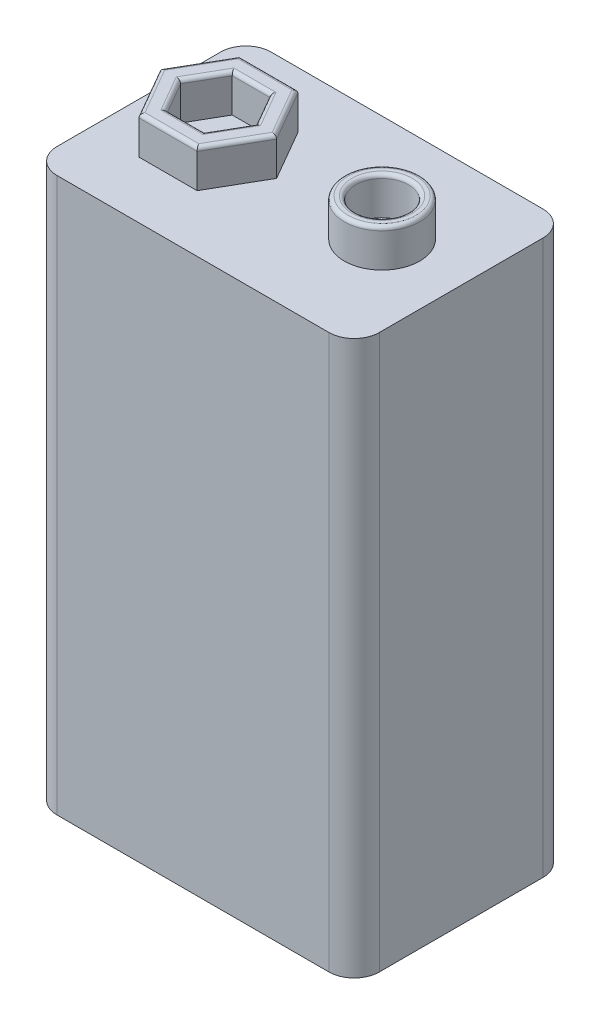
ISO-10303-21;
HEADER;
FILE_DESCRIPTION(('STEP AP214'),'2;1');
FILE_NAME('part.step','',(''),(''),'','','');
FILE_SCHEMA(('AUTOMOTIVE_DESIGN { 1 0 10303 214 1 1 1 1 }'));
ENDSEC;
DATA;
#1=APPLICATION_CONTEXT('core data for automotive mechanical design processes');
#2=APPLICATION_PROTOCOL_DEFINITION('international standard','automotive_design',2000,#1);
#3=PRODUCT_CONTEXT('',#1,'mechanical');
#4=PRODUCT('Part','Part','',(#3));
#5=PRODUCT_RELATED_PRODUCT_CATEGORY('part','',(#4));
#6=PRODUCT_DEFINITION_FORMATION('','',#4);
#7=PRODUCT_DEFINITION_CONTEXT('part definition',#1,'design');
#8=PRODUCT_DEFINITION('design','',#6,#7);
#9=PRODUCT_DEFINITION_SHAPE('','',#8);
#10=(LENGTH_UNIT() NAMED_UNIT(*) SI_UNIT(.MILLI.,.METRE.));
#11=(NAMED_UNIT(*) PLANE_ANGLE_UNIT() SI_UNIT($,.RADIAN.));
#12=(NAMED_UNIT(*) SI_UNIT($,.STERADIAN.) SOLID_ANGLE_UNIT());
#13=UNCERTAINTY_MEASURE_WITH_UNIT(LENGTH_MEASURE(1.E-05),#10,'distance_accuracy_value','');
#14=(GEOMETRIC_REPRESENTATION_CONTEXT(3) GLOBAL_UNCERTAINTY_ASSIGNED_CONTEXT((#13)) GLOBAL_UNIT_ASSIGNED_CONTEXT((#10,
#11,#12)) REPRESENTATION_CONTEXT('',''));
#15=CARTESIAN_POINT('',(0.,0.,0.));
#16=DIRECTION('',(0.,0.,1.));
#17=DIRECTION('',(1.,0.,0.));
#18=AXIS2_PLACEMENT_3D('',#15,#16,#17);
#19=CARTESIAN_POINT('',(0.,44.,0.));
#20=DIRECTION('',(0.,-1.,0.));
#21=DIRECTION('',(0.,0.,-1.));
#22=AXIS2_PLACEMENT_3D('',#19,#20,#21);
#23=PLANE('',#22);
#24=CARTESIAN_POINT('',(6.4976700158354,44.,-0.020872178799304));
#25=DIRECTION('',(0.,-1.,0.));
#26=DIRECTION('',(0.,0.,-1.));
#27=AXIS2_PLACEMENT_3D('',#24,#25,#26);
#28=CIRCLE('',#27,3.);
#29=CARTESIAN_POINT('',(6.4976700158354,44.,-3.02087217879931));
#30=VERTEX_POINT('',#29);
#31=EDGE_CURVE('E405',#30,#30,#28,.F.);
#32=ORIENTED_EDGE('',*,*,#31,.F.);
#33=EDGE_LOOP('',(#32));
#34=FACE_BOUND('',#33,.T.);
#35=DIRECTION('',(0.,0.,-1.));
#36=VECTOR('',#35,1.);
#37=CARTESIAN_POINT('',(12.8,44.,8.5));
#38=LINE('',#37,#36);
#39=CARTESIAN_POINT('',(12.8,44.,6.5));
#40=VERTEX_POINT('',#39);
#41=CARTESIAN_POINT('',(12.8,44.,-6.5));
#42=VERTEX_POINT('',#41);
#43=EDGE_CURVE('E322',#40,#42,#38,.T.);
#44=ORIENTED_EDGE('',*,*,#43,.T.);
#45=CARTESIAN_POINT('',(10.8,44.,-6.5));
#46=DIRECTION('',(0.,-1.,0.));
#47=DIRECTION('',(0.,0.,-1.));
#48=AXIS2_PLACEMENT_3D('',#45,#46,#47);
#49=CIRCLE('',#48,2.);
#50=CARTESIAN_POINT('',(10.8,44.,-8.5));
#51=VERTEX_POINT('',#50);
#52=EDGE_CURVE('E388',#42,#51,#49,.F.);
#53=ORIENTED_EDGE('',*,*,#52,.T.);
#54=DIRECTION('',(-1.,0.,0.));
#55=VECTOR('',#54,1.);
#56=CARTESIAN_POINT('',(-12.8,44.,-8.5));
#57=LINE('',#56,#55);
#58=CARTESIAN_POINT('',(-10.8,44.,-8.5));
#59=VERTEX_POINT('',#58);
#60=EDGE_CURVE('E326',#51,#59,#57,.T.);
#61=ORIENTED_EDGE('',*,*,#60,.T.);
#62=CARTESIAN_POINT('',(-10.8,44.,-6.5));
#63=DIRECTION('',(0.,-1.,0.));
#64=DIRECTION('',(0.,0.,-1.));
#65=AXIS2_PLACEMENT_3D('',#62,#63,#64);
#66=CIRCLE('',#65,2.);
#67=CARTESIAN_POINT('',(-12.8,44.,-6.5));
#68=VERTEX_POINT('',#67);
#69=EDGE_CURVE('E382',#59,#68,#66,.F.);
#70=ORIENTED_EDGE('',*,*,#69,.T.);
#71=DIRECTION('',(0.,0.,1.));
#72=VECTOR('',#71,1.);
#73=CARTESIAN_POINT('',(-12.8,44.,8.5));
#74=LINE('',#73,#72);
#75=CARTESIAN_POINT('',(-12.8,44.,6.5));
#76=VERTEX_POINT('',#75);
#77=EDGE_CURVE('E331',#68,#76,#74,.T.);
#78=ORIENTED_EDGE('',*,*,#77,.T.);
#79=CARTESIAN_POINT('',(-10.8,44.,6.5));
#80=DIRECTION('',(0.,-1.,0.));
#81=DIRECTION('',(0.,0.,-1.));
#82=AXIS2_PLACEMENT_3D('',#79,#80,#81);
#83=CIRCLE('',#82,2.);
#84=CARTESIAN_POINT('',(-10.8,44.,8.5));
#85=VERTEX_POINT('',#84);
#86=EDGE_CURVE('E379',#76,#85,#83,.F.);
#87=ORIENTED_EDGE('',*,*,#86,.T.);
#88=DIRECTION('',(1.,0.,0.));
#89=VECTOR('',#88,1.);
#90=CARTESIAN_POINT('',(-12.8,44.,8.5));
#91=LINE('',#90,#89);
#92=CARTESIAN_POINT('',(10.8,44.,8.5));
#93=VERTEX_POINT('',#92);
#94=EDGE_CURVE('E335',#85,#93,#91,.T.);
#95=ORIENTED_EDGE('',*,*,#94,.T.);
#96=CARTESIAN_POINT('',(10.8,44.,6.5));
#97=DIRECTION('',(0.,-1.,0.));
#98=DIRECTION('',(0.,0.,-1.));
#99=AXIS2_PLACEMENT_3D('',#96,#97,#98);
#100=CIRCLE('',#99,2.);
#101=EDGE_CURVE('E385',#93,#40,#100,.F.);
#102=ORIENTED_EDGE('',*,*,#101,.T.);
#103=EDGE_LOOP('',(#44,#53,#61,#70,#78,#87,#95,#102));
#104=FACE_BOUND('',#103,.T.);
#105=DIRECTION('',(0.5,0.,-0.866025403784439));
#106=VECTOR('',#105,1.);
#107=CARTESIAN_POINT('',(-4.19292890740609,44.,3.97912782120069));
#108=LINE('',#107,#106);
#109=CARTESIAN_POINT('',(-4.19292890740609,44.,3.97912782120069));
#110=VERTEX_POINT('',#109);
#111=CARTESIAN_POINT('',(-1.88352783064759,44.,-0.0208721787993011));
#112=VERTEX_POINT('',#111);
#113=EDGE_CURVE('E226',#110,#112,#108,.T.);
#114=ORIENTED_EDGE('',*,*,#113,.F.);
#115=DIRECTION('',(1.,0.,0.));
#116=VECTOR('',#115,1.);
#117=CARTESIAN_POINT('',(-8.8117310609231,44.,3.97912782120069));
#118=LINE('',#117,#116);
#119=CARTESIAN_POINT('',(-8.8117310609231,44.,3.97912782120069));
#120=VERTEX_POINT('',#119);
#121=EDGE_CURVE('E295',#120,#110,#118,.T.);
#122=ORIENTED_EDGE('',*,*,#121,.F.);
#123=DIRECTION('',(0.5,0.,0.866025403784439));
#124=VECTOR('',#123,1.);
#125=CARTESIAN_POINT('',(-11.1211321376816,44.,-0.0208721787993057));
#126=LINE('',#125,#124);
#127=CARTESIAN_POINT('',(-11.1211321376816,44.,-0.020872178799306));
#128=VERTEX_POINT('',#127);
#129=EDGE_CURVE('E291',#128,#120,#126,.T.);
#130=ORIENTED_EDGE('',*,*,#129,.F.);
#131=DIRECTION('',(-0.5,0.,0.866025403784438));
#132=VECTOR('',#131,1.);
#133=CARTESIAN_POINT('',(-8.8117310609231,44.,-4.0208721787993));
#134=LINE('',#133,#132);
#135=CARTESIAN_POINT('',(-8.8117310609231,44.,-4.0208721787993));
#136=VERTEX_POINT('',#135);
#137=EDGE_CURVE('E287',#136,#128,#134,.T.);
#138=ORIENTED_EDGE('',*,*,#137,.F.);
#139=DIRECTION('',(-1.,0.,0.));
#140=VECTOR('',#139,1.);
#141=CARTESIAN_POINT('',(-4.1929289074061,44.,-4.02087217879931));
#142=LINE('',#141,#140);
#143=CARTESIAN_POINT('',(-4.1929289074061,44.,-4.02087217879931));
#144=VERTEX_POINT('',#143);
#145=EDGE_CURVE('E283',#144,#136,#142,.T.);
#146=ORIENTED_EDGE('',*,*,#145,.F.);
#147=DIRECTION('',(-0.5,0.,-0.866025403784439));
#148=VECTOR('',#147,1.);
#149=CARTESIAN_POINT('',(-1.88352783064759,44.,-0.0208721787993012));
#150=LINE('',#149,#148);
#151=EDGE_CURVE('E279',#112,#144,#150,.T.);
#152=ORIENTED_EDGE('',*,*,#151,.F.);
#153=EDGE_LOOP('',(#114,#122,#130,#138,#146,#152));
#154=FACE_BOUND('',#153,.T.);
#155=ADVANCED_FACE('F39',(#34,#104,#154),#23,.F.);
#156=CARTESIAN_POINT('',(12.8,44.,8.5));
#157=DIRECTION('',(-1.,0.,0.));
#158=DIRECTION('',(0.,0.,1.));
#159=AXIS2_PLACEMENT_3D('',#156,#157,#158);
#160=PLANE('',#159);
#161=DIRECTION('',(0.,0.,-1.));
#162=VECTOR('',#161,1.);
#163=CARTESIAN_POINT('',(12.8,0.,8.5));
#164=LINE('',#163,#162);
#165=CARTESIAN_POINT('',(12.8,0.,6.5));
#166=VERTEX_POINT('',#165);
#167=CARTESIAN_POINT('',(12.8,0.,-6.5));
#168=VERTEX_POINT('',#167);
#169=EDGE_CURVE('E321',#166,#168,#164,.T.);
#170=ORIENTED_EDGE('',*,*,#169,.T.);
#171=DIRECTION('',(0.,-1.,0.));
#172=VECTOR('',#171,1.);
#173=CARTESIAN_POINT('',(12.8,44.,-6.5));
#174=LINE('',#173,#172);
#175=EDGE_CURVE('E376',#168,#42,#174,.F.);
#176=ORIENTED_EDGE('',*,*,#175,.T.);
#177=ORIENTED_EDGE('',*,*,#43,.F.);
#178=DIRECTION('',(0.,-1.,0.));
#179=VECTOR('',#178,1.);
#180=CARTESIAN_POINT('',(12.8,44.,6.5));
#181=LINE('',#180,#179);
#182=EDGE_CURVE('E372',#40,#166,#181,.T.);
#183=ORIENTED_EDGE('',*,*,#182,.T.);
#184=EDGE_LOOP('',(#170,#176,#177,#183));
#185=FACE_BOUND('',#184,.T.);
#186=ADVANCED_FACE('F587',(#185),#160,.F.);
#187=CARTESIAN_POINT('',(-12.8,44.,-8.5));
#188=DIRECTION('',(0.,0.,1.));
#189=DIRECTION('',(1.,0.,0.));
#190=AXIS2_PLACEMENT_3D('',#187,#188,#189);
#191=PLANE('',#190);
#192=ORIENTED_EDGE('',*,*,#60,.F.);
#193=DIRECTION('',(0.,-1.,0.));
#194=VECTOR('',#193,1.);
#195=CARTESIAN_POINT('',(10.8,44.,-8.5));
#196=LINE('',#195,#194);
#197=CARTESIAN_POINT('',(10.8,0.,-8.5));
#198=VERTEX_POINT('',#197);
#199=EDGE_CURVE('E356',#51,#198,#196,.T.);
#200=ORIENTED_EDGE('',*,*,#199,.T.);
#201=DIRECTION('',(-1.,0.,0.));
#202=VECTOR('',#201,1.);
#203=CARTESIAN_POINT('',(-12.8,0.,-8.5));
#204=LINE('',#203,#202);
#205=CARTESIAN_POINT('',(-10.8,0.,-8.5));
#206=VERTEX_POINT('',#205);
#207=EDGE_CURVE('E343',#198,#206,#204,.T.);
#208=ORIENTED_EDGE('',*,*,#207,.T.);
#209=DIRECTION('',(0.,-1.,0.));
#210=VECTOR('',#209,1.);
#211=CARTESIAN_POINT('',(-10.8,44.,-8.5));
#212=LINE('',#211,#210);
#213=EDGE_CURVE('E339',#206,#59,#212,.F.);
#214=ORIENTED_EDGE('',*,*,#213,.T.);
#215=EDGE_LOOP('',(#192,#200,#208,#214));
#216=FACE_BOUND('',#215,.T.);
#217=ADVANCED_FACE('F594',(#216),#191,.F.);
#218=CARTESIAN_POINT('',(-12.8,44.,8.5));
#219=DIRECTION('',(1.,0.,0.));
#220=DIRECTION('',(0.,0.,-1.));
#221=AXIS2_PLACEMENT_3D('',#218,#219,#220);
#222=PLANE('',#221);
#223=ORIENTED_EDGE('',*,*,#77,.F.);
#224=DIRECTION('',(0.,-1.,0.));
#225=VECTOR('',#224,1.);
#226=CARTESIAN_POINT('',(-12.8,44.,-6.5));
#227=LINE('',#226,#225);
#228=CARTESIAN_POINT('',(-12.8,0.,-6.5));
#229=VERTEX_POINT('',#228);
#230=EDGE_CURVE('E401',#68,#229,#227,.T.);
#231=ORIENTED_EDGE('',*,*,#230,.T.);
#232=DIRECTION('',(0.,0.,1.));
#233=VECTOR('',#232,1.);
#234=CARTESIAN_POINT('',(-12.8,0.,8.5));
#235=LINE('',#234,#233);
#236=CARTESIAN_POINT('',(-12.8,0.,6.5));
#237=VERTEX_POINT('',#236);
#238=EDGE_CURVE('E347',#229,#237,#235,.T.);
#239=ORIENTED_EDGE('',*,*,#238,.T.);
#240=DIRECTION('',(0.,-1.,0.));
#241=VECTOR('',#240,1.);
#242=CARTESIAN_POINT('',(-12.8,44.,6.5));
#243=LINE('',#242,#241);
#244=EDGE_CURVE('E398',#237,#76,#243,.F.);
#245=ORIENTED_EDGE('',*,*,#244,.T.);
#246=EDGE_LOOP('',(#223,#231,#239,#245));
#247=FACE_BOUND('',#246,.T.);
#248=ADVANCED_FACE('F826',(#247),#222,.F.);
#249=CARTESIAN_POINT('',(-12.8,44.,8.5));
#250=DIRECTION('',(0.,0.,-1.));
#251=DIRECTION('',(-1.,0.,0.));
#252=AXIS2_PLACEMENT_3D('',#249,#250,#251);
#253=PLANE('',#252);
#254=DIRECTION('',(1.,0.,0.));
#255=VECTOR('',#254,1.);
#256=CARTESIAN_POINT('',(-12.8,0.,8.5));
#257=LINE('',#256,#255);
#258=CARTESIAN_POINT('',(-10.8,0.,8.5));
#259=VERTEX_POINT('',#258);
#260=CARTESIAN_POINT('',(10.8,0.,8.5));
#261=VERTEX_POINT('',#260);
#262=EDGE_CURVE('E327',#259,#261,#257,.T.);
#263=ORIENTED_EDGE('',*,*,#262,.T.);
#264=DIRECTION('',(0.,-1.,0.));
#265=VECTOR('',#264,1.);
#266=CARTESIAN_POINT('',(10.8,44.,8.5));
#267=LINE('',#266,#265);
#268=EDGE_CURVE('E395',#261,#93,#267,.F.);
#269=ORIENTED_EDGE('',*,*,#268,.T.);
#270=ORIENTED_EDGE('',*,*,#94,.F.);
#271=DIRECTION('',(0.,-1.,0.));
#272=VECTOR('',#271,1.);
#273=CARTESIAN_POINT('',(-10.8,44.,8.5));
#274=LINE('',#273,#272);
#275=EDGE_CURVE('E391',#85,#259,#274,.T.);
#276=ORIENTED_EDGE('',*,*,#275,.T.);
#277=EDGE_LOOP('',(#263,#269,#270,#276));
#278=FACE_BOUND('',#277,.T.);
#279=ADVANCED_FACE('F830',(#278),#253,.F.);
#280=CARTESIAN_POINT('',(0.,0.,0.));
#281=DIRECTION('',(0.,-1.,0.));
#282=DIRECTION('',(0.,0.,-1.));
#283=AXIS2_PLACEMENT_3D('',#280,#281,#282);
#284=PLANE('',#283);
#285=ORIENTED_EDGE('',*,*,#207,.F.);
#286=CARTESIAN_POINT('',(10.8,0.,-6.5));
#287=DIRECTION('',(0.,-1.,0.));
#288=DIRECTION('',(0.,0.,-1.));
#289=AXIS2_PLACEMENT_3D('',#286,#287,#288);
#290=CIRCLE('',#289,2.);
#291=EDGE_CURVE('E369',#198,#168,#290,.T.);
#292=ORIENTED_EDGE('',*,*,#291,.T.);
#293=ORIENTED_EDGE('',*,*,#169,.F.);
#294=CARTESIAN_POINT('',(10.8,0.,6.5));
#295=DIRECTION('',(0.,-1.,0.));
#296=DIRECTION('',(0.,0.,-1.));
#297=AXIS2_PLACEMENT_3D('',#294,#295,#296);
#298=CIRCLE('',#297,2.);
#299=EDGE_CURVE('E366',#166,#261,#298,.T.);
#300=ORIENTED_EDGE('',*,*,#299,.T.);
#301=ORIENTED_EDGE('',*,*,#262,.F.);
#302=CARTESIAN_POINT('',(-10.8,0.,6.5));
#303=DIRECTION('',(0.,-1.,0.));
#304=DIRECTION('',(0.,0.,-1.));
#305=AXIS2_PLACEMENT_3D('',#302,#303,#304);
#306=CIRCLE('',#305,2.);
#307=EDGE_CURVE('E360',#259,#237,#306,.T.);
#308=ORIENTED_EDGE('',*,*,#307,.T.);
#309=ORIENTED_EDGE('',*,*,#238,.F.);
#310=CARTESIAN_POINT('',(-10.8,0.,-6.5));
#311=DIRECTION('',(0.,-1.,0.));
#312=DIRECTION('',(0.,0.,-1.));
#313=AXIS2_PLACEMENT_3D('',#310,#311,#312);
#314=CIRCLE('',#313,2.);
#315=EDGE_CURVE('E363',#229,#206,#314,.T.);
#316=ORIENTED_EDGE('',*,*,#315,.T.);
#317=EDGE_LOOP('',(#285,#292,#293,#300,#301,#308,#309,#316));
#318=FACE_BOUND('',#317,.T.);
#319=ADVANCED_FACE('F821',(#318),#284,.T.);
#320=CARTESIAN_POINT('',(10.8,44.,-6.5));
#321=DIRECTION('',(0.,-1.,0.));
#322=DIRECTION('',(0.,0.,-1.));
#323=AXIS2_PLACEMENT_3D('',#320,#321,#322);
#324=CYLINDRICAL_SURFACE('',#323,2.);
#325=ORIENTED_EDGE('',*,*,#52,.F.);
#326=ORIENTED_EDGE('',*,*,#175,.F.);
#327=ORIENTED_EDGE('',*,*,#291,.F.);
#328=ORIENTED_EDGE('',*,*,#199,.F.);
#329=EDGE_LOOP('',(#325,#326,#327,#328));
#330=FACE_BOUND('',#329,.T.);
#331=ADVANCED_FACE('F818',(#330),#324,.T.);
#332=CARTESIAN_POINT('',(10.8,44.,6.5));
#333=DIRECTION('',(0.,-1.,0.));
#334=DIRECTION('',(0.,0.,-1.));
#335=AXIS2_PLACEMENT_3D('',#332,#333,#334);
#336=CYLINDRICAL_SURFACE('',#335,2.);
#337=ORIENTED_EDGE('',*,*,#101,.F.);
#338=ORIENTED_EDGE('',*,*,#268,.F.);
#339=ORIENTED_EDGE('',*,*,#299,.F.);
#340=ORIENTED_EDGE('',*,*,#182,.F.);
#341=EDGE_LOOP('',(#337,#338,#339,#340));
#342=FACE_BOUND('',#341,.T.);
#343=ADVANCED_FACE('F814',(#342),#336,.T.);
#344=CARTESIAN_POINT('',(-10.8,44.,-6.5));
#345=DIRECTION('',(0.,-1.,0.));
#346=DIRECTION('',(0.,0.,-1.));
#347=AXIS2_PLACEMENT_3D('',#344,#345,#346);
#348=CYLINDRICAL_SURFACE('',#347,2.);
#349=ORIENTED_EDGE('',*,*,#69,.F.);
#350=ORIENTED_EDGE('',*,*,#213,.F.);
#351=ORIENTED_EDGE('',*,*,#315,.F.);
#352=ORIENTED_EDGE('',*,*,#230,.F.);
#353=EDGE_LOOP('',(#349,#350,#351,#352));
#354=FACE_BOUND('',#353,.T.);
#355=ADVANCED_FACE('F810',(#354),#348,.T.);
#356=CARTESIAN_POINT('',(-10.8,44.,6.5));
#357=DIRECTION('',(0.,-1.,0.));
#358=DIRECTION('',(0.,0.,-1.));
#359=AXIS2_PLACEMENT_3D('',#356,#357,#358);
#360=CYLINDRICAL_SURFACE('',#359,2.);
#361=ORIENTED_EDGE('',*,*,#86,.F.);
#362=ORIENTED_EDGE('',*,*,#244,.F.);
#363=ORIENTED_EDGE('',*,*,#307,.F.);
#364=ORIENTED_EDGE('',*,*,#275,.F.);
#365=EDGE_LOOP('',(#361,#362,#363,#364));
#366=FACE_BOUND('',#365,.T.);
#367=ADVANCED_FACE('F806',(#366),#360,.T.);
#368=CARTESIAN_POINT('',(6.4976700158354,47.,-0.020872178799304));
#369=DIRECTION('',(0.,1.,0.));
#370=DIRECTION('',(0.,0.,1.));
#371=AXIS2_PLACEMENT_3D('',#368,#369,#370);
#372=PLANE('',#371);
#373=CARTESIAN_POINT('',(6.4976700158354,47.,-0.020872178799304));
#374=DIRECTION('',(0.,1.,0.));
#375=DIRECTION('',(0.,0.,1.));
#376=AXIS2_PLACEMENT_3D('',#373,#374,#375);
#377=CIRCLE('',#376,2.4);
#378=CARTESIAN_POINT('',(6.4976700158354,47.,2.37912782120069));
#379=VERTEX_POINT('',#378);
#380=EDGE_CURVE('E417',#379,#379,#377,.F.);
#381=ORIENTED_EDGE('',*,*,#380,.T.);
#382=EDGE_LOOP('',(#381));
#383=FACE_BOUND('',#382,.T.);
#384=CARTESIAN_POINT('',(6.4976700158354,47.,-0.020872178799304));
#385=DIRECTION('',(0.,1.,0.));
#386=DIRECTION('',(0.,0.,1.));
#387=AXIS2_PLACEMENT_3D('',#384,#385,#386);
#388=CIRCLE('',#387,2.7);
#389=CARTESIAN_POINT('',(6.4976700158354,47.,2.6791278212007));
#390=VERTEX_POINT('',#389);
#391=EDGE_CURVE('E413',#390,#390,#388,.T.);
#392=ORIENTED_EDGE('',*,*,#391,.T.);
#393=EDGE_LOOP('',(#392));
#394=FACE_BOUND('',#393,.T.);
#395=ADVANCED_FACE('F809',(#383,#394),#372,.T.);
#396=CARTESIAN_POINT('',(6.4976700158354,47.,-0.020872178799304));
#397=DIRECTION('',(0.,-1.,0.));
#398=DIRECTION('',(0.,0.,-1.));
#399=AXIS2_PLACEMENT_3D('',#396,#397,#398);
#400=CYLINDRICAL_SURFACE('',#399,3.);
#401=CARTESIAN_POINT('',(6.4976700158354,46.7,-0.020872178799304));
#402=DIRECTION('',(0.,1.,0.));
#403=DIRECTION('',(0.,0.,1.));
#404=AXIS2_PLACEMENT_3D('',#401,#402,#403);
#405=CIRCLE('',#404,3.);
#406=CARTESIAN_POINT('',(6.4976700158354,46.7,2.9791278212007));
#407=VERTEX_POINT('',#406);
#408=EDGE_CURVE('E421',#407,#407,#405,.F.);
#409=ORIENTED_EDGE('',*,*,#408,.T.);
#410=EDGE_LOOP('',(#409));
#411=FACE_BOUND('',#410,.T.);
#412=ORIENTED_EDGE('',*,*,#31,.T.);
#413=EDGE_LOOP('',(#412));
#414=FACE_BOUND('',#413,.T.);
#415=ADVANCED_FACE('F882',(#411,#414),#400,.T.);
#416=CARTESIAN_POINT('',(6.4976700158354,47.,-0.020872178799304));
#417=DIRECTION('',(0.,-1.,0.));
#418=DIRECTION('',(0.,0.,-1.));
#419=AXIS2_PLACEMENT_3D('',#416,#417,#418);
#420=CYLINDRICAL_SURFACE('',#419,2.1);
#421=CARTESIAN_POINT('',(6.4976700158354,46.7,-0.020872178799304));
#422=DIRECTION('',(0.,1.,0.));
#423=DIRECTION('',(0.,0.,1.));
#424=AXIS2_PLACEMENT_3D('',#421,#422,#423);
#425=CIRCLE('',#424,2.1);
#426=CARTESIAN_POINT('',(6.4976700158354,46.7,2.0791278212007));
#427=VERTEX_POINT('',#426);
#428=EDGE_CURVE('E409',#427,#427,#425,.T.);
#429=ORIENTED_EDGE('',*,*,#428,.T.);
#430=EDGE_LOOP('',(#429));
#431=FACE_BOUND('',#430,.T.);
#432=CARTESIAN_POINT('',(6.4976700158354,44.,-0.020872178799304));
#433=DIRECTION('',(0.,1.,0.));
#434=DIRECTION('',(0.,0.,1.));
#435=AXIS2_PLACEMENT_3D('',#432,#433,#434);
#436=CIRCLE('',#435,2.1);
#437=CARTESIAN_POINT('',(6.4976700158354,44.,2.0791278212007));
#438=VERTEX_POINT('',#437);
#439=EDGE_CURVE('E317',#438,#438,#436,.T.);
#440=ORIENTED_EDGE('',*,*,#439,.F.);
#441=EDGE_LOOP('',(#440));
#442=FACE_BOUND('',#441,.T.);
#443=ADVANCED_FACE('F602',(#431,#442),#420,.F.);
#444=ORIENTED_EDGE('',*,*,#439,.T.);
#445=EDGE_LOOP('',(#444));
#446=FACE_BOUND('',#445,.T.);
#447=ADVANCED_FACE('F590',(#446),#23,.F.);
#448=CARTESIAN_POINT('',(0.,47.,0.));
#449=DIRECTION('',(0.,1.,0.));
#450=DIRECTION('',(0.,0.,1.));
#451=AXIS2_PLACEMENT_3D('',#448,#449,#450);
#452=PLANE('',#451);
#453=DIRECTION('',(-0.5,0.,0.866025403784439));
#454=VECTOR('',#453,1.);
#455=CARTESIAN_POINT('',(-7.39725907763458,47.,-4.27080951973773));
#456=LINE('',#455,#454);
#457=CARTESIAN_POINT('',(-9.85096154546442,47.,-0.0208721787993059));
#458=VERTEX_POINT('',#457);
#459=CARTESIAN_POINT('',(-8.17664576481451,47.,-2.9208721787993));
#460=VERTEX_POINT('',#459);
#461=EDGE_CURVE('E460',#458,#460,#456,.F.);
#462=ORIENTED_EDGE('',*,*,#461,.T.);
#463=DIRECTION('',(-1.,0.,0.));
#464=VECTOR('',#463,1.);
#465=CARTESIAN_POINT('',(0.,47.,-2.9208721787993));
#466=LINE('',#465,#464);
#467=CARTESIAN_POINT('',(-4.82801420351468,47.,-2.9208721787993));
#468=VERTEX_POINT('',#467);
#469=EDGE_CURVE('E463',#460,#468,#466,.F.);
#470=ORIENTED_EDGE('',*,*,#469,.T.);
#471=DIRECTION('',(-0.5,0.,-0.866025403784439));
#472=VECTOR('',#471,1.);
#473=CARTESIAN_POINT('',(-2.35623589861231,47.,1.36037343033808));
#474=LINE('',#473,#472);
#475=CARTESIAN_POINT('',(-3.15369842286477,47.,-0.0208721787993013));
#476=VERTEX_POINT('',#475);
#477=EDGE_CURVE('E448',#468,#476,#474,.F.);
#478=ORIENTED_EDGE('',*,*,#477,.T.);
#479=DIRECTION('',(0.5,0.,-0.866025403784439));
#480=VECTOR('',#479,1.);
#481=CARTESIAN_POINT('',(-2.37431173568484,47.,-1.37080951973773));
#482=LINE('',#481,#480);
#483=CARTESIAN_POINT('',(-4.82801420351468,47.,2.8791278212007));
#484=VERTEX_POINT('',#483);
#485=EDGE_CURVE('E451',#476,#484,#482,.F.);
#486=ORIENTED_EDGE('',*,*,#485,.T.);
#487=DIRECTION('',(1.,0.,0.));
#488=VECTOR('',#487,1.);
#489=CARTESIAN_POINT('',(0.,47.,2.8791278212007));
#490=LINE('',#489,#488);
#491=CARTESIAN_POINT('',(-8.17664576481451,47.,2.8791278212007));
#492=VERTEX_POINT('',#491);
#493=EDGE_CURVE('E454',#484,#492,#490,.F.);
#494=ORIENTED_EDGE('',*,*,#493,.T.);
#495=DIRECTION('',(0.5,0.,0.866025403784439));
#496=VECTOR('',#495,1.);
#497=CARTESIAN_POINT('',(-7.37918324056205,47.,4.26037343033808));
#498=LINE('',#497,#496);
#499=EDGE_CURVE('E457',#492,#458,#498,.F.);
#500=ORIENTED_EDGE('',*,*,#499,.T.);
#501=EDGE_LOOP('',(#462,#470,#478,#486,#494,#500));
#502=FACE_BOUND('',#501,.T.);
#503=DIRECTION('',(0.5,0.,0.866025403784439));
#504=VECTOR('',#503,1.);
#505=CARTESIAN_POINT('',(-8.55192343978777,47.,3.82912782120069));
#506=LINE('',#505,#504);
#507=CARTESIAN_POINT('',(-10.7747219761678,47.,-0.0208721787993057));
#508=VERTEX_POINT('',#507);
#509=CARTESIAN_POINT('',(-8.63852598016621,47.,3.67912782120069));
#510=VERTEX_POINT('',#509);
#511=EDGE_CURVE('E441',#508,#510,#506,.T.);
#512=ORIENTED_EDGE('',*,*,#511,.T.);
#513=DIRECTION('',(1.,0.,0.));
#514=VECTOR('',#513,1.);
#515=CARTESIAN_POINT('',(-4.19292890740609,47.,3.67912782120069));
#516=LINE('',#515,#514);
#517=CARTESIAN_POINT('',(-4.36613398816298,47.,3.67912782120069));
#518=VERTEX_POINT('',#517);
#519=EDGE_CURVE('E444',#510,#518,#516,.T.);
#520=ORIENTED_EDGE('',*,*,#519,.T.);
#521=DIRECTION('',(0.5,0.,-0.866025403784439));
#522=VECTOR('',#521,1.);
#523=CARTESIAN_POINT('',(-2.14333545178292,47.,-0.170872178799301));
#524=LINE('',#523,#522);
#525=CARTESIAN_POINT('',(-2.22993799216136,47.,-0.0208721787993012));
#526=VERTEX_POINT('',#525);
#527=EDGE_CURVE('E429',#518,#526,#524,.T.);
#528=ORIENTED_EDGE('',*,*,#527,.T.);
#529=DIRECTION('',(-0.5,0.,-0.866025403784439));
#530=VECTOR('',#529,1.);
#531=CARTESIAN_POINT('',(-4.45273652854143,47.,-3.87087217879931));
#532=LINE('',#531,#530);
#533=CARTESIAN_POINT('',(-4.36613398816298,47.,-3.72087217879931));
#534=VERTEX_POINT('',#533);
#535=EDGE_CURVE('E432',#526,#534,#532,.T.);
#536=ORIENTED_EDGE('',*,*,#535,.T.);
#537=DIRECTION('',(-1.,0.,0.));
#538=VECTOR('',#537,1.);
#539=CARTESIAN_POINT('',(-8.8117310609231,47.,-3.72087217879931));
#540=LINE('',#539,#538);
#541=CARTESIAN_POINT('',(-8.63852598016621,47.,-3.72087217879931));
#542=VERTEX_POINT('',#541);
#543=EDGE_CURVE('E435',#534,#542,#540,.T.);
#544=ORIENTED_EDGE('',*,*,#543,.T.);
#545=DIRECTION('',(-0.5,0.,0.866025403784439));
#546=VECTOR('',#545,1.);
#547=CARTESIAN_POINT('',(-10.8613245165463,47.,0.129127821200694));
#548=LINE('',#547,#546);
#549=EDGE_CURVE('E438',#542,#508,#548,.T.);
#550=ORIENTED_EDGE('',*,*,#549,.T.);
#551=EDGE_LOOP('',(#512,#520,#528,#536,#544,#550));
#552=FACE_BOUND('',#551,.T.);
#553=ADVANCED_FACE('F584',(#502,#552),#452,.T.);
#554=CARTESIAN_POINT('',(-4.19292890740609,47.,3.97912782120069));
#555=DIRECTION('',(-0.866025403784439,0.,-0.5));
#556=DIRECTION('',(-0.5,0.,0.866025403784439));
#557=AXIS2_PLACEMENT_3D('',#554,#555,#556);
#558=PLANE('',#557);
#559=DIRECTION('',(0.,-1.,0.));
#560=VECTOR('',#559,1.);
#561=CARTESIAN_POINT('',(-1.88352783064759,47.,-0.0208721787993012));
#562=LINE('',#561,#560);
#563=CARTESIAN_POINT('',(-1.88352783064759,46.7,-0.0208721787993012));
#564=VERTEX_POINT('',#563);
#565=EDGE_CURVE('E314',#564,#112,#562,.T.);
#566=ORIENTED_EDGE('',*,*,#565,.F.);
#567=DIRECTION('',(0.5,0.,-0.866025403784439));
#568=VECTOR('',#567,1.);
#569=CARTESIAN_POINT('',(-4.19292890740609,46.7,3.9791278212007));
#570=LINE('',#569,#568);
#571=CARTESIAN_POINT('',(-4.19292890740609,46.7,3.97912782120069));
#572=VERTEX_POINT('',#571);
#573=EDGE_CURVE('E11',#564,#572,#570,.F.);
#574=ORIENTED_EDGE('',*,*,#573,.T.);
#575=DIRECTION('',(0.,-1.,0.));
#576=VECTOR('',#575,1.);
#577=CARTESIAN_POINT('',(-4.19292890740609,47.,3.97912782120069));
#578=LINE('',#577,#576);
#579=EDGE_CURVE('E299',#572,#110,#578,.T.);
#580=ORIENTED_EDGE('',*,*,#579,.T.);
#581=ORIENTED_EDGE('',*,*,#113,.T.);
#582=EDGE_LOOP('',(#566,#574,#580,#581));
#583=FACE_BOUND('',#582,.T.);
#584=ADVANCED_FACE('F550',(#583),#558,.F.);
#585=CARTESIAN_POINT('',(-1.88352783064759,47.,-0.0208721787993012));
#586=DIRECTION('',(-0.866025403784439,0.,0.5));
#587=DIRECTION('',(0.5,0.,0.866025403784439));
#588=AXIS2_PLACEMENT_3D('',#585,#586,#587);
#589=PLANE('',#588);
#590=DIRECTION('',(0.,-1.,0.));
#591=VECTOR('',#590,1.);
#592=CARTESIAN_POINT('',(-4.1929289074061,47.,-4.02087217879931));
#593=LINE('',#592,#591);
#594=CARTESIAN_POINT('',(-4.1929289074061,46.7,-4.02087217879931));
#595=VERTEX_POINT('',#594);
#596=EDGE_CURVE('E311',#595,#144,#593,.T.);
#597=ORIENTED_EDGE('',*,*,#596,.F.);
#598=DIRECTION('',(-0.5,0.,-0.866025403784439));
#599=VECTOR('',#598,1.);
#600=CARTESIAN_POINT('',(-1.88352783064759,46.7,-0.0208721787993015));
#601=LINE('',#600,#599);
#602=EDGE_CURVE('E49',#595,#564,#601,.F.);
#603=ORIENTED_EDGE('',*,*,#602,.T.);
#604=ORIENTED_EDGE('',*,*,#565,.T.);
#605=ORIENTED_EDGE('',*,*,#151,.T.);
#606=EDGE_LOOP('',(#597,#603,#604,#605));
#607=FACE_BOUND('',#606,.T.);
#608=ADVANCED_FACE('F576',(#607),#589,.F.);
#609=CARTESIAN_POINT('',(-4.1929289074061,47.,-4.02087217879931));
#610=DIRECTION('',(0.,0.,1.));
#611=DIRECTION('',(1.,0.,0.));
#612=AXIS2_PLACEMENT_3D('',#609,#610,#611);
#613=PLANE('',#612);
#614=DIRECTION('',(0.,-1.,0.));
#615=VECTOR('',#614,1.);
#616=CARTESIAN_POINT('',(-8.8117310609231,47.,-4.0208721787993));
#617=LINE('',#616,#615);
#618=CARTESIAN_POINT('',(-8.8117310609231,46.7,-4.0208721787993));
#619=VERTEX_POINT('',#618);
#620=EDGE_CURVE('E308',#619,#136,#617,.T.);
#621=ORIENTED_EDGE('',*,*,#620,.F.);
#622=DIRECTION('',(-1.,0.,0.));
#623=VECTOR('',#622,1.);
#624=CARTESIAN_POINT('',(-4.1929289074061,46.7,-4.02087217879931));
#625=LINE('',#624,#623);
#626=EDGE_CURVE('E64',#619,#595,#625,.F.);
#627=ORIENTED_EDGE('',*,*,#626,.T.);
#628=ORIENTED_EDGE('',*,*,#596,.T.);
#629=ORIENTED_EDGE('',*,*,#145,.T.);
#630=EDGE_LOOP('',(#621,#627,#628,#629));
#631=FACE_BOUND('',#630,.T.);
#632=ADVANCED_FACE('F575',(#631),#613,.F.);
#633=CARTESIAN_POINT('',(-8.8117310609231,47.,-4.0208721787993));
#634=DIRECTION('',(0.866025403784439,0.,0.5));
#635=DIRECTION('',(0.5,0.,-0.866025403784439));
#636=AXIS2_PLACEMENT_3D('',#633,#634,#635);
#637=PLANE('',#636);
#638=DIRECTION('',(0.,-1.,0.));
#639=VECTOR('',#638,1.);
#640=CARTESIAN_POINT('',(-11.1211321376816,47.,-0.0208721787993057));
#641=LINE('',#640,#639);
#642=CARTESIAN_POINT('',(-11.1211321376816,46.7,-0.0208721787993057));
#643=VERTEX_POINT('',#642);
#644=EDGE_CURVE('E305',#643,#128,#641,.T.);
#645=ORIENTED_EDGE('',*,*,#644,.F.);
#646=DIRECTION('',(-0.5,0.,0.866025403784439));
#647=VECTOR('',#646,1.);
#648=CARTESIAN_POINT('',(-8.8117310609231,46.7,-4.0208721787993));
#649=LINE('',#648,#647);
#650=EDGE_CURVE('E488',#643,#619,#649,.F.);
#651=ORIENTED_EDGE('',*,*,#650,.T.);
#652=ORIENTED_EDGE('',*,*,#620,.T.);
#653=ORIENTED_EDGE('',*,*,#137,.T.);
#654=EDGE_LOOP('',(#645,#651,#652,#653));
#655=FACE_BOUND('',#654,.T.);
#656=ADVANCED_FACE('F570',(#655),#637,.F.);
#657=CARTESIAN_POINT('',(-11.1211321376816,47.,-0.0208721787993057));
#658=DIRECTION('',(0.866025403784439,0.,-0.5));
#659=DIRECTION('',(-0.5,0.,-0.866025403784439));
#660=AXIS2_PLACEMENT_3D('',#657,#658,#659);
#661=PLANE('',#660);
#662=DIRECTION('',(0.,-1.,0.));
#663=VECTOR('',#662,1.);
#664=CARTESIAN_POINT('',(-8.8117310609231,47.,3.97912782120069));
#665=LINE('',#664,#663);
#666=CARTESIAN_POINT('',(-8.8117310609231,46.7,3.97912782120069));
#667=VERTEX_POINT('',#666);
#668=EDGE_CURVE('E302',#667,#120,#665,.T.);
#669=ORIENTED_EDGE('',*,*,#668,.F.);
#670=DIRECTION('',(0.5,0.,0.866025403784439));
#671=VECTOR('',#670,1.);
#672=CARTESIAN_POINT('',(-11.1211321376816,46.7,-0.020872178799308));
#673=LINE('',#672,#671);
#674=EDGE_CURVE('E485',#667,#643,#673,.F.);
#675=ORIENTED_EDGE('',*,*,#674,.T.);
#676=ORIENTED_EDGE('',*,*,#644,.T.);
#677=ORIENTED_EDGE('',*,*,#129,.T.);
#678=EDGE_LOOP('',(#669,#675,#676,#677));
#679=FACE_BOUND('',#678,.T.);
#680=ADVANCED_FACE('F567',(#679),#661,.F.);
#681=CARTESIAN_POINT('',(-8.8117310609231,47.,3.97912782120069));
#682=DIRECTION('',(0.,0.,-1.));
#683=DIRECTION('',(-1.,0.,0.));
#684=AXIS2_PLACEMENT_3D('',#681,#682,#683);
#685=PLANE('',#684);
#686=ORIENTED_EDGE('',*,*,#579,.F.);
#687=DIRECTION('',(1.,0.,0.));
#688=VECTOR('',#687,1.);
#689=CARTESIAN_POINT('',(-8.8117310609231,46.7,3.97912782120069));
#690=LINE('',#689,#688);
#691=EDGE_CURVE('E481',#572,#667,#690,.F.);
#692=ORIENTED_EDGE('',*,*,#691,.T.);
#693=ORIENTED_EDGE('',*,*,#668,.T.);
#694=ORIENTED_EDGE('',*,*,#121,.T.);
#695=EDGE_LOOP('',(#686,#692,#693,#694));
#696=FACE_BOUND('',#695,.T.);
#697=ADVANCED_FACE('F554',(#696),#685,.F.);
#698=CARTESIAN_POINT('',(-5.00121928427157,47.,2.5791278212007));
#699=DIRECTION('',(-0.866025403784439,0.,-0.5));
#700=DIRECTION('',(-0.5,0.,0.866025403784439));
#701=AXIS2_PLACEMENT_3D('',#698,#699,#700);
#702=PLANE('',#701);
#703=DIRECTION('',(0.,-1.,0.));
#704=VECTOR('',#703,1.);
#705=CARTESIAN_POINT('',(-5.00121928427157,47.,2.5791278212007));
#706=LINE('',#705,#704);
#707=CARTESIAN_POINT('',(-5.00121928427157,46.7,2.5791278212007));
#708=VERTEX_POINT('',#707);
#709=CARTESIAN_POINT('',(-5.00121928427157,44.,2.5791278212007));
#710=VERTEX_POINT('',#709);
#711=EDGE_CURVE('E262',#708,#710,#706,.T.);
#712=ORIENTED_EDGE('',*,*,#711,.F.);
#713=DIRECTION('',(0.5,0.,-0.866025403784439));
#714=VECTOR('',#713,1.);
#715=CARTESIAN_POINT('',(-5.00121928427157,46.7,2.5791278212007));
#716=LINE('',#715,#714);
#717=CARTESIAN_POINT('',(-3.50010858437854,46.7,-0.0208721787993012));
#718=VERTEX_POINT('',#717);
#719=EDGE_CURVE('E222',#708,#718,#716,.T.);
#720=ORIENTED_EDGE('',*,*,#719,.T.);
#721=DIRECTION('',(0.,-1.,0.));
#722=VECTOR('',#721,1.);
#723=CARTESIAN_POINT('',(-3.50010858437854,47.,-0.0208721787993012));
#724=LINE('',#723,#722);
#725=CARTESIAN_POINT('',(-3.50010858437854,44.,-0.0208721787993012));
#726=VERTEX_POINT('',#725);
#727=EDGE_CURVE('E214',#718,#726,#724,.T.);
#728=ORIENTED_EDGE('',*,*,#727,.T.);
#729=DIRECTION('',(0.5,0.,-0.866025403784439));
#730=VECTOR('',#729,1.);
#731=CARTESIAN_POINT('',(-5.00121928427157,44.,2.5791278212007));
#732=LINE('',#731,#730);
#733=EDGE_CURVE('E219',#710,#726,#732,.T.);
#734=ORIENTED_EDGE('',*,*,#733,.F.);
#735=EDGE_LOOP('',(#712,#720,#728,#734));
#736=FACE_BOUND('',#735,.T.);
#737=ADVANCED_FACE('F217',(#736),#702,.T.);
#738=CARTESIAN_POINT('',(-3.50010858437854,47.,-0.0208721787993012));
#739=DIRECTION('',(-0.866025403784439,0.,0.5));
#740=DIRECTION('',(0.5,0.,0.866025403784439));
#741=AXIS2_PLACEMENT_3D('',#738,#739,#740);
#742=PLANE('',#741);
#743=ORIENTED_EDGE('',*,*,#727,.F.);
#744=DIRECTION('',(-0.5,0.,-0.866025403784439));
#745=VECTOR('',#744,1.);
#746=CARTESIAN_POINT('',(-3.50010858437854,46.7,-0.0208721787993012));
#747=LINE('',#746,#745);
#748=CARTESIAN_POINT('',(-5.00121928427157,46.7,-2.6208721787993));
#749=VERTEX_POINT('',#748);
#750=EDGE_CURVE('E478',#718,#749,#747,.T.);
#751=ORIENTED_EDGE('',*,*,#750,.T.);
#752=DIRECTION('',(0.,-1.,0.));
#753=VECTOR('',#752,1.);
#754=CARTESIAN_POINT('',(-5.00121928427157,47.,-2.6208721787993));
#755=LINE('',#754,#753);
#756=CARTESIAN_POINT('',(-5.00121928427157,44.,-2.6208721787993));
#757=VERTEX_POINT('',#756);
#758=EDGE_CURVE('E227',#749,#757,#755,.T.);
#759=ORIENTED_EDGE('',*,*,#758,.T.);
#760=DIRECTION('',(-0.5,0.,-0.866025403784439));
#761=VECTOR('',#760,1.);
#762=CARTESIAN_POINT('',(-3.50010858437854,44.,-0.0208721787993012));
#763=LINE('',#762,#761);
#764=EDGE_CURVE('E230',#726,#757,#763,.T.);
#765=ORIENTED_EDGE('',*,*,#764,.F.);
#766=EDGE_LOOP('',(#743,#751,#759,#765));
#767=FACE_BOUND('',#766,.T.);
#768=ADVANCED_FACE('F231',(#767),#742,.T.);
#769=CARTESIAN_POINT('',(-5.00121928427157,47.,-2.6208721787993));
#770=DIRECTION('',(0.,0.,1.));
#771=DIRECTION('',(1.,0.,0.));
#772=AXIS2_PLACEMENT_3D('',#769,#770,#771);
#773=PLANE('',#772);
#774=ORIENTED_EDGE('',*,*,#758,.F.);
#775=DIRECTION('',(-1.,0.,0.));
#776=VECTOR('',#775,1.);
#777=CARTESIAN_POINT('',(-5.00121928427157,46.7,-2.6208721787993));
#778=LINE('',#777,#776);
#779=CARTESIAN_POINT('',(-8.00344068405762,46.7,-2.6208721787993));
#780=VERTEX_POINT('',#779);
#781=EDGE_CURVE('E425',#749,#780,#778,.T.);
#782=ORIENTED_EDGE('',*,*,#781,.T.);
#783=DIRECTION('',(0.,-1.,0.));
#784=VECTOR('',#783,1.);
#785=CARTESIAN_POINT('',(-8.00344068405762,47.,-2.6208721787993));
#786=LINE('',#785,#784);
#787=CARTESIAN_POINT('',(-8.00344068405762,44.,-2.6208721787993));
#788=VERTEX_POINT('',#787);
#789=EDGE_CURVE('E271',#780,#788,#786,.T.);
#790=ORIENTED_EDGE('',*,*,#789,.T.);
#791=DIRECTION('',(-1.,0.,0.));
#792=VECTOR('',#791,1.);
#793=CARTESIAN_POINT('',(-5.00121928427157,44.,-2.6208721787993));
#794=LINE('',#793,#792);
#795=EDGE_CURVE('E237',#757,#788,#794,.T.);
#796=ORIENTED_EDGE('',*,*,#795,.F.);
#797=EDGE_LOOP('',(#774,#782,#790,#796));
#798=FACE_BOUND('',#797,.T.);
#799=ADVANCED_FACE('F627',(#798),#773,.T.);
#800=CARTESIAN_POINT('',(-8.00344068405762,47.,-2.6208721787993));
#801=DIRECTION('',(0.866025403784439,0.,0.5));
#802=DIRECTION('',(0.5,0.,-0.866025403784439));
#803=AXIS2_PLACEMENT_3D('',#800,#801,#802);
#804=PLANE('',#803);
#805=ORIENTED_EDGE('',*,*,#789,.F.);
#806=DIRECTION('',(-0.5,0.,0.866025403784439));
#807=VECTOR('',#806,1.);
#808=CARTESIAN_POINT('',(-8.00344068405762,46.7,-2.6208721787993));
#809=LINE('',#808,#807);
#810=CARTESIAN_POINT('',(-9.50455138395065,46.7,-0.0208721787993062));
#811=VERTEX_POINT('',#810);
#812=EDGE_CURVE('E467',#780,#811,#809,.T.);
#813=ORIENTED_EDGE('',*,*,#812,.T.);
#814=DIRECTION('',(0.,-1.,0.));
#815=VECTOR('',#814,1.);
#816=CARTESIAN_POINT('',(-9.50455138395065,47.,-0.0208721787993062));
#817=LINE('',#816,#815);
#818=CARTESIAN_POINT('',(-9.50455138395065,44.,-0.0208721787993062));
#819=VERTEX_POINT('',#818);
#820=EDGE_CURVE('E268',#811,#819,#817,.T.);
#821=ORIENTED_EDGE('',*,*,#820,.T.);
#822=DIRECTION('',(-0.5,0.,0.866025403784439));
#823=VECTOR('',#822,1.);
#824=CARTESIAN_POINT('',(-8.00344068405762,44.,-2.6208721787993));
#825=LINE('',#824,#823);
#826=EDGE_CURVE('E253',#788,#819,#825,.T.);
#827=ORIENTED_EDGE('',*,*,#826,.F.);
#828=EDGE_LOOP('',(#805,#813,#821,#827));
#829=FACE_BOUND('',#828,.T.);
#830=ADVANCED_FACE('F620',(#829),#804,.T.);
#831=CARTESIAN_POINT('',(-9.50455138395065,47.,-0.0208721787993062));
#832=DIRECTION('',(0.866025403784438,0.,-0.5));
#833=DIRECTION('',(-0.5,0.,-0.866025403784439));
#834=AXIS2_PLACEMENT_3D('',#831,#832,#833);
#835=PLANE('',#834);
#836=ORIENTED_EDGE('',*,*,#820,.F.);
#837=DIRECTION('',(0.5,0.,0.866025403784439));
#838=VECTOR('',#837,1.);
#839=CARTESIAN_POINT('',(-9.50455138395065,46.7,-0.0208721787993062));
#840=LINE('',#839,#838);
#841=CARTESIAN_POINT('',(-8.00344068405762,46.7,2.5791278212007));
#842=VERTEX_POINT('',#841);
#843=EDGE_CURVE('E470',#811,#842,#840,.T.);
#844=ORIENTED_EDGE('',*,*,#843,.T.);
#845=DIRECTION('',(0.,-1.,0.));
#846=VECTOR('',#845,1.);
#847=CARTESIAN_POINT('',(-8.00344068405762,47.,2.5791278212007));
#848=LINE('',#847,#846);
#849=CARTESIAN_POINT('',(-8.00344068405762,44.,2.5791278212007));
#850=VERTEX_POINT('',#849);
#851=EDGE_CURVE('E265',#842,#850,#848,.T.);
#852=ORIENTED_EDGE('',*,*,#851,.T.);
#853=DIRECTION('',(0.5,0.,0.866025403784439));
#854=VECTOR('',#853,1.);
#855=CARTESIAN_POINT('',(-9.50455138395065,44.,-0.0208721787993062));
#856=LINE('',#855,#854);
#857=EDGE_CURVE('E257',#819,#850,#856,.T.);
#858=ORIENTED_EDGE('',*,*,#857,.F.);
#859=EDGE_LOOP('',(#836,#844,#852,#858));
#860=FACE_BOUND('',#859,.T.);
#861=ADVANCED_FACE('F614',(#860),#835,.T.);
#862=CARTESIAN_POINT('',(-8.00344068405762,47.,2.5791278212007));
#863=DIRECTION('',(0.,0.,-1.));
#864=DIRECTION('',(-1.,0.,0.));
#865=AXIS2_PLACEMENT_3D('',#862,#863,#864);
#866=PLANE('',#865);
#867=ORIENTED_EDGE('',*,*,#851,.F.);
#868=DIRECTION('',(1.,0.,0.));
#869=VECTOR('',#868,1.);
#870=CARTESIAN_POINT('',(-8.00344068405762,46.7,2.5791278212007));
#871=LINE('',#870,#869);
#872=EDGE_CURVE('E473',#842,#708,#871,.T.);
#873=ORIENTED_EDGE('',*,*,#872,.T.);
#874=ORIENTED_EDGE('',*,*,#711,.T.);
#875=DIRECTION('',(1.,0.,0.));
#876=VECTOR('',#875,1.);
#877=CARTESIAN_POINT('',(-8.00344068405762,44.,2.5791278212007));
#878=LINE('',#877,#876);
#879=EDGE_CURVE('E242',#850,#710,#878,.T.);
#880=ORIENTED_EDGE('',*,*,#879,.F.);
#881=EDGE_LOOP('',(#867,#873,#874,#880));
#882=FACE_BOUND('',#881,.T.);
#883=ADVANCED_FACE('F606',(#882),#866,.T.);
#884=ORIENTED_EDGE('',*,*,#879,.T.);
#885=ORIENTED_EDGE('',*,*,#733,.T.);
#886=ORIENTED_EDGE('',*,*,#764,.T.);
#887=ORIENTED_EDGE('',*,*,#795,.T.);
#888=ORIENTED_EDGE('',*,*,#826,.T.);
#889=ORIENTED_EDGE('',*,*,#857,.T.);
#890=EDGE_LOOP('',(#884,#885,#886,#887,#888,#889));
#891=FACE_BOUND('',#890,.T.);
#892=ADVANCED_FACE('F239',(#891),#23,.F.);
#893=CARTESIAN_POINT('',(6.4976700158354,46.7,-0.020872178799304));
#894=DIRECTION('',(0.,1.,0.));
#895=DIRECTION('',(0.,0.,1.));
#896=AXIS2_PLACEMENT_3D('',#893,#894,#895);
#897=TOROIDAL_SURFACE('',#896,2.4,0.3);
#898=ORIENTED_EDGE('',*,*,#380,.F.);
#899=EDGE_LOOP('',(#898));
#900=FACE_BOUND('',#899,.T.);
#901=ORIENTED_EDGE('',*,*,#428,.F.);
#902=EDGE_LOOP('',(#901));
#903=FACE_BOUND('',#902,.T.);
#904=ADVANCED_FACE('F605',(#900,#903),#897,.T.);
#905=CARTESIAN_POINT('',(6.4976700158354,46.7,-0.020872178799304));
#906=DIRECTION('',(0.,1.,0.));
#907=DIRECTION('',(0.,0.,1.));
#908=AXIS2_PLACEMENT_3D('',#905,#906,#907);
#909=TOROIDAL_SURFACE('',#908,2.7,0.3);
#910=ORIENTED_EDGE('',*,*,#408,.F.);
#911=EDGE_LOOP('',(#910));
#912=FACE_BOUND('',#911,.T.);
#913=ORIENTED_EDGE('',*,*,#391,.F.);
#914=EDGE_LOOP('',(#913));
#915=FACE_BOUND('',#914,.T.);
#916=ADVANCED_FACE('F611',(#912,#915),#909,.T.);
#917=CARTESIAN_POINT('',(-8.00344068405762,46.7,2.8791278212007));
#918=DIRECTION('',(1.,0.,0.));
#919=DIRECTION('',(0.,0.,-1.));
#920=AXIS2_PLACEMENT_3D('',#917,#918,#919);
#921=CYLINDRICAL_SURFACE('',#920,0.3);
#922=CARTESIAN_POINT('',(-8.17664576481451,46.7,2.8791278212007));
#923=DIRECTION('',(0.866025403784439,0.,0.5));
#924=DIRECTION('',(-0.5,0.,0.866025403784439));
#925=AXIS2_PLACEMENT_3D('',#922,#923,#924);
#926=ELLIPSE('',#925,0.346410161513775,0.3);
#927=EDGE_CURVE('E248',#492,#842,#926,.F.);
#928=ORIENTED_EDGE('',*,*,#927,.F.);
#929=ORIENTED_EDGE('',*,*,#493,.F.);
#930=CARTESIAN_POINT('',(-4.82801420351468,46.7,2.8791278212007));
#931=DIRECTION('',(0.866025403784439,0.,-0.5));
#932=DIRECTION('',(0.5,0.,0.866025403784439));
#933=AXIS2_PLACEMENT_3D('',#930,#931,#932);
#934=ELLIPSE('',#933,0.346410161513775,0.3);
#935=EDGE_CURVE('E244',#708,#484,#934,.T.);
#936=ORIENTED_EDGE('',*,*,#935,.F.);
#937=ORIENTED_EDGE('',*,*,#872,.F.);
#938=EDGE_LOOP('',(#928,#929,#936,#937));
#939=FACE_BOUND('',#938,.T.);
#940=ADVANCED_FACE('F695',(#939),#921,.T.);
#941=CARTESIAN_POINT('',(-4.74141166313623,46.7,2.7291278212007));
#942=DIRECTION('',(0.5,0.,-0.866025403784439));
#943=DIRECTION('',(-0.866025403784439,0.,-0.5));
#944=AXIS2_PLACEMENT_3D('',#941,#942,#943);
#945=CYLINDRICAL_SURFACE('',#944,0.3);
#946=ORIENTED_EDGE('',*,*,#935,.T.);
#947=ORIENTED_EDGE('',*,*,#485,.F.);
#948=CARTESIAN_POINT('',(-3.15369842286477,46.7,-0.0208721787993003));
#949=DIRECTION('',(0.,0.,-1.));
#950=DIRECTION('',(1.,0.,0.));
#951=AXIS2_PLACEMENT_3D('',#948,#949,#950);
#952=ELLIPSE('',#951,0.346410161513775,0.3);
#953=EDGE_CURVE('E505',#718,#476,#952,.T.);
#954=ORIENTED_EDGE('',*,*,#953,.F.);
#955=ORIENTED_EDGE('',*,*,#719,.F.);
#956=EDGE_LOOP('',(#946,#947,#954,#955));
#957=FACE_BOUND('',#956,.T.);
#958=ADVANCED_FACE('F705',(#957),#945,.T.);
#959=CARTESIAN_POINT('',(-9.76435900508598,46.7,0.129127821200694));
#960=DIRECTION('',(0.5,0.,0.866025403784439));
#961=DIRECTION('',(0.866025403784439,0.,-0.5));
#962=AXIS2_PLACEMENT_3D('',#959,#960,#961);
#963=CYLINDRICAL_SURFACE('',#962,0.3);
#964=ORIENTED_EDGE('',*,*,#927,.T.);
#965=ORIENTED_EDGE('',*,*,#843,.F.);
#966=CARTESIAN_POINT('',(-9.85096154546442,46.7,-0.0208721787993055));
#967=DIRECTION('',(0.,0.,1.));
#968=DIRECTION('',(-1.,0.,0.));
#969=AXIS2_PLACEMENT_3D('',#966,#967,#968);
#970=ELLIPSE('',#969,0.346410161513775,0.3);
#971=EDGE_CURVE('E501',#458,#811,#970,.F.);
#972=ORIENTED_EDGE('',*,*,#971,.F.);
#973=ORIENTED_EDGE('',*,*,#499,.F.);
#974=EDGE_LOOP('',(#964,#965,#972,#973));
#975=FACE_BOUND('',#974,.T.);
#976=ADVANCED_FACE('F715',(#975),#963,.T.);
#977=CARTESIAN_POINT('',(-3.24030096324321,46.7,-0.170872178799301));
#978=DIRECTION('',(-0.5,0.,-0.866025403784439));
#979=DIRECTION('',(-0.866025403784439,0.,0.5));
#980=AXIS2_PLACEMENT_3D('',#977,#978,#979);
#981=CYLINDRICAL_SURFACE('',#980,0.3);
#982=ORIENTED_EDGE('',*,*,#953,.T.);
#983=ORIENTED_EDGE('',*,*,#477,.F.);
#984=CARTESIAN_POINT('',(-4.82801420351468,46.7,-2.9208721787993));
#985=DIRECTION('',(-0.866025403784439,0.,-0.5));
#986=DIRECTION('',(-0.5,0.,0.866025403784439));
#987=AXIS2_PLACEMENT_3D('',#984,#985,#986);
#988=ELLIPSE('',#987,0.346410161513775,0.3);
#989=EDGE_CURVE('E498',#749,#468,#988,.T.);
#990=ORIENTED_EDGE('',*,*,#989,.F.);
#991=ORIENTED_EDGE('',*,*,#750,.F.);
#992=EDGE_LOOP('',(#982,#983,#990,#991));
#993=FACE_BOUND('',#992,.T.);
#994=ADVANCED_FACE('F725',(#993),#981,.T.);
#995=CARTESIAN_POINT('',(-8.26324830519295,46.7,-2.7708721787993));
#996=DIRECTION('',(-0.5,0.,0.866025403784439));
#997=DIRECTION('',(0.866025403784439,0.,0.5));
#998=AXIS2_PLACEMENT_3D('',#995,#996,#997);
#999=CYLINDRICAL_SURFACE('',#998,0.3);
#1000=ORIENTED_EDGE('',*,*,#971,.T.);
#1001=ORIENTED_EDGE('',*,*,#812,.F.);
#1002=CARTESIAN_POINT('',(-8.17664576481451,46.7,-2.9208721787993));
#1003=DIRECTION('',(-0.866025403784439,0.,0.5));
#1004=DIRECTION('',(-0.5,0.,-0.866025403784439));
#1005=AXIS2_PLACEMENT_3D('',#1002,#1003,#1004);
#1006=ELLIPSE('',#1005,0.346410161513775,0.3);
#1007=EDGE_CURVE('E495',#460,#780,#1006,.F.);
#1008=ORIENTED_EDGE('',*,*,#1007,.F.);
#1009=ORIENTED_EDGE('',*,*,#461,.F.);
#1010=EDGE_LOOP('',(#1000,#1001,#1008,#1009));
#1011=FACE_BOUND('',#1010,.T.);
#1012=ADVANCED_FACE('F735',(#1011),#999,.T.);
#1013=CARTESIAN_POINT('',(-5.00121928427157,46.7,-2.9208721787993));
#1014=DIRECTION('',(-1.,0.,0.));
#1015=DIRECTION('',(0.,0.,1.));
#1016=AXIS2_PLACEMENT_3D('',#1013,#1014,#1015);
#1017=CYLINDRICAL_SURFACE('',#1016,0.3);
#1018=ORIENTED_EDGE('',*,*,#989,.T.);
#1019=ORIENTED_EDGE('',*,*,#469,.F.);
#1020=ORIENTED_EDGE('',*,*,#1007,.T.);
#1021=ORIENTED_EDGE('',*,*,#781,.F.);
#1022=EDGE_LOOP('',(#1018,#1019,#1020,#1021));
#1023=FACE_BOUND('',#1022,.T.);
#1024=ADVANCED_FACE('F745',(#1023),#1017,.T.);
#1025=CARTESIAN_POINT('',(0.,46.7,-3.72087217879931));
#1026=DIRECTION('',(1.,0.,0.));
#1027=DIRECTION('',(0.,0.,-1.));
#1028=AXIS2_PLACEMENT_3D('',#1025,#1026,#1027);
#1029=CYLINDRICAL_SURFACE('',#1028,0.3);
#1030=CARTESIAN_POINT('',(-4.36613398816298,46.7,-3.72087217879931));
#1031=DIRECTION('',(0.866025403784439,0.,0.5));
#1032=DIRECTION('',(-0.5,0.,0.866025403784439));
#1033=AXIS2_PLACEMENT_3D('',#1030,#1031,#1032);
#1034=ELLIPSE('',#1033,0.346410161513775,0.3);
#1035=EDGE_CURVE('E525',#595,#534,#1034,.T.);
#1036=ORIENTED_EDGE('',*,*,#1035,.F.);
#1037=ORIENTED_EDGE('',*,*,#626,.F.);
#1038=CARTESIAN_POINT('',(-8.63852598016621,46.7,-3.72087217879931));
#1039=DIRECTION('',(0.866025403784439,0.,-0.5));
#1040=DIRECTION('',(0.5,0.,0.866025403784439));
#1041=AXIS2_PLACEMENT_3D('',#1038,#1039,#1040);
#1042=ELLIPSE('',#1041,0.346410161513775,0.3);
#1043=EDGE_CURVE('E43',#542,#619,#1042,.F.);
#1044=ORIENTED_EDGE('',*,*,#1043,.F.);
#1045=ORIENTED_EDGE('',*,*,#543,.F.);
#1046=EDGE_LOOP('',(#1036,#1037,#1044,#1045));
#1047=FACE_BOUND('',#1046,.T.);
#1048=ADVANCED_FACE('F41',(#1047),#1029,.T.);
#1049=CARTESIAN_POINT('',(-8.09007940066214,46.7,-4.67080951973773));
#1050=DIRECTION('',(0.5,0.,-0.866025403784439));
#1051=DIRECTION('',(-0.866025403784439,0.,-0.5));
#1052=AXIS2_PLACEMENT_3D('',#1049,#1050,#1051);
#1053=CYLINDRICAL_SURFACE('',#1052,0.3);
#1054=ORIENTED_EDGE('',*,*,#1043,.T.);
#1055=ORIENTED_EDGE('',*,*,#650,.F.);
#1056=CARTESIAN_POINT('',(-10.7747219761678,46.7,-0.0208721787993095));
#1057=DIRECTION('',(0.,0.,-1.));
#1058=DIRECTION('',(1.,0.,0.));
#1059=AXIS2_PLACEMENT_3D('',#1056,#1057,#1058);
#1060=ELLIPSE('',#1059,0.346410161513775,0.3);
#1061=EDGE_CURVE('E522',#508,#643,#1060,.F.);
#1062=ORIENTED_EDGE('',*,*,#1061,.F.);
#1063=ORIENTED_EDGE('',*,*,#549,.F.);
#1064=EDGE_LOOP('',(#1054,#1055,#1062,#1063));
#1065=FACE_BOUND('',#1064,.T.);
#1066=ADVANCED_FACE('F537',(#1065),#1053,.T.);
#1067=CARTESIAN_POINT('',(-1.66341557558476,46.7,0.960373430338078));
#1068=DIRECTION('',(0.5,0.,0.866025403784439));
#1069=DIRECTION('',(0.866025403784439,0.,-0.5));
#1070=AXIS2_PLACEMENT_3D('',#1067,#1068,#1069);
#1071=CYLINDRICAL_SURFACE('',#1070,0.3);
#1072=ORIENTED_EDGE('',*,*,#1035,.T.);
#1073=ORIENTED_EDGE('',*,*,#535,.F.);
#1074=CARTESIAN_POINT('',(-2.22993799216136,46.7,-0.0208721787993018));
#1075=DIRECTION('',(0.,0.,1.));
#1076=DIRECTION('',(-1.,0.,0.));
#1077=AXIS2_PLACEMENT_3D('',#1074,#1075,#1076);
#1078=ELLIPSE('',#1077,0.346410161513775,0.3);
#1079=EDGE_CURVE('E518',#564,#526,#1078,.T.);
#1080=ORIENTED_EDGE('',*,*,#1079,.F.);
#1081=ORIENTED_EDGE('',*,*,#602,.F.);
#1082=EDGE_LOOP('',(#1072,#1073,#1080,#1081));
#1083=FACE_BOUND('',#1082,.T.);
#1084=ADVANCED_FACE('F542',(#1083),#1071,.T.);
#1085=CARTESIAN_POINT('',(-8.07200356358961,46.7,4.66037343033808));
#1086=DIRECTION('',(-0.5,0.,-0.866025403784439));
#1087=DIRECTION('',(-0.866025403784439,0.,0.5));
#1088=AXIS2_PLACEMENT_3D('',#1085,#1086,#1087);
#1089=CYLINDRICAL_SURFACE('',#1088,0.3);
#1090=ORIENTED_EDGE('',*,*,#1061,.T.);
#1091=ORIENTED_EDGE('',*,*,#674,.F.);
#1092=CARTESIAN_POINT('',(-8.63852598016621,46.7,3.67912782120069));
#1093=DIRECTION('',(-0.866025403784439,0.,-0.5));
#1094=DIRECTION('',(0.5,0.,-0.866025403784439));
#1095=AXIS2_PLACEMENT_3D('',#1092,#1093,#1094);
#1096=ELLIPSE('',#1095,0.346410161513775,0.3);
#1097=EDGE_CURVE('E515',#510,#667,#1096,.F.);
#1098=ORIENTED_EDGE('',*,*,#1097,.F.);
#1099=ORIENTED_EDGE('',*,*,#511,.F.);
#1100=EDGE_LOOP('',(#1090,#1091,#1098,#1099));
#1101=FACE_BOUND('',#1100,.T.);
#1102=ADVANCED_FACE('F564',(#1101),#1089,.T.);
#1103=CARTESIAN_POINT('',(-1.68149141265729,46.7,-0.970809519737728));
#1104=DIRECTION('',(-0.5,0.,0.866025403784439));
#1105=DIRECTION('',(0.866025403784439,0.,0.5));
#1106=AXIS2_PLACEMENT_3D('',#1103,#1104,#1105);
#1107=CYLINDRICAL_SURFACE('',#1106,0.3);
#1108=ORIENTED_EDGE('',*,*,#1079,.T.);
#1109=ORIENTED_EDGE('',*,*,#527,.F.);
#1110=CARTESIAN_POINT('',(-4.36613398816298,46.7,3.67912782120069));
#1111=DIRECTION('',(-0.866025403784439,0.,0.5));
#1112=DIRECTION('',(0.5,0.,0.866025403784439));
#1113=AXIS2_PLACEMENT_3D('',#1110,#1111,#1112);
#1114=ELLIPSE('',#1113,0.346410161513775,0.3);
#1115=EDGE_CURVE('E512',#572,#518,#1114,.T.);
#1116=ORIENTED_EDGE('',*,*,#1115,.F.);
#1117=ORIENTED_EDGE('',*,*,#573,.F.);
#1118=EDGE_LOOP('',(#1108,#1109,#1116,#1117));
#1119=FACE_BOUND('',#1118,.T.);
#1120=ADVANCED_FACE('F547',(#1119),#1107,.T.);
#1121=CARTESIAN_POINT('',(0.,46.7,3.67912782120069));
#1122=DIRECTION('',(-1.,0.,0.));
#1123=DIRECTION('',(0.,0.,1.));
#1124=AXIS2_PLACEMENT_3D('',#1121,#1122,#1123);
#1125=CYLINDRICAL_SURFACE('',#1124,0.3);
#1126=ORIENTED_EDGE('',*,*,#1097,.T.);
#1127=ORIENTED_EDGE('',*,*,#691,.F.);
#1128=ORIENTED_EDGE('',*,*,#1115,.T.);
#1129=ORIENTED_EDGE('',*,*,#519,.F.);
#1130=EDGE_LOOP('',(#1126,#1127,#1128,#1129));
#1131=FACE_BOUND('',#1130,.T.);
#1132=ADVANCED_FACE('F558',(#1131),#1125,.T.);
#1133=CLOSED_SHELL('',(#155,#186,#217,#248,#279,#319,#331,#343,#355,#367,#395,#415,#443,#447,
#553,#584,#608,#632,#656,#680,#697,#737,#768,#799,#830,#861,#883,#892,#904,#916,#940,#958,#976,
#994,#1012,#1024,#1048,#1066,#1084,#1102,#1120,#1132));
#1134=MANIFOLD_SOLID_BREP('B2',#1133);
#1135=ADVANCED_BREP_SHAPE_REPRESENTATION('',(#18,#1134),#14);
#1136=SHAPE_DEFINITION_REPRESENTATION(#9,#1135);
ENDSEC;
END-ISO-10303-21;
